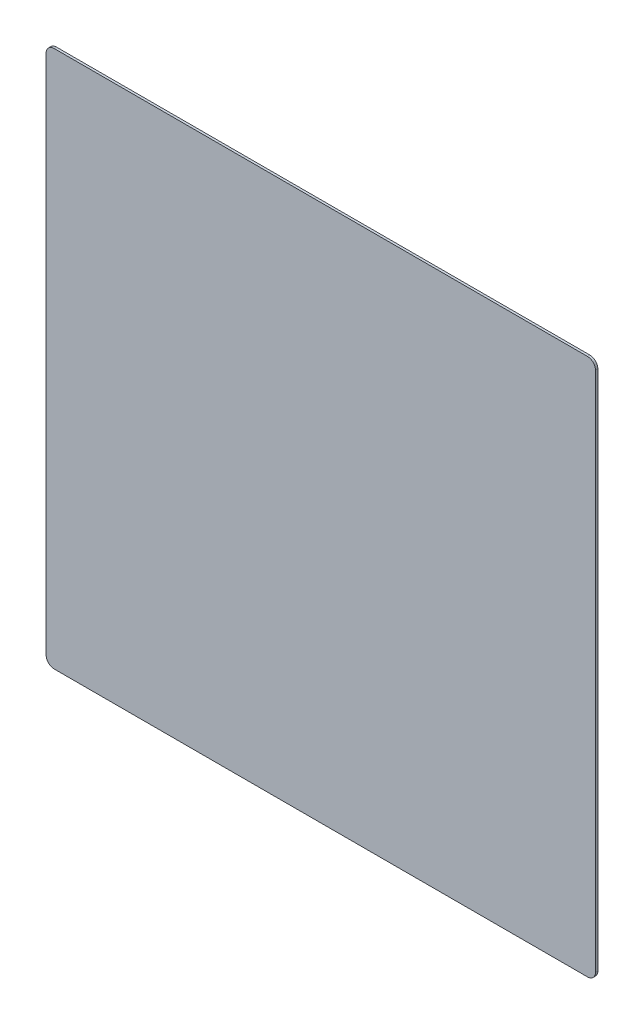
ISO-10303-21;
HEADER;
FILE_DESCRIPTION(('STEP AP214'),'2;1');
FILE_NAME('part.step','',(''),(''),'','','');
FILE_SCHEMA(('AUTOMOTIVE_DESIGN { 1 0 10303 214 1 1 1 1 }'));
ENDSEC;
DATA;
#1=APPLICATION_CONTEXT('core data for automotive mechanical design processes');
#2=APPLICATION_PROTOCOL_DEFINITION('international standard','automotive_design',2000,#1);
#3=PRODUCT_CONTEXT('',#1,'mechanical');
#4=PRODUCT('Part','Part','',(#3));
#5=PRODUCT_RELATED_PRODUCT_CATEGORY('part','',(#4));
#6=PRODUCT_DEFINITION_FORMATION('','',#4);
#7=PRODUCT_DEFINITION_CONTEXT('part definition',#1,'design');
#8=PRODUCT_DEFINITION('design','',#6,#7);
#9=PRODUCT_DEFINITION_SHAPE('','',#8);
#10=(LENGTH_UNIT() NAMED_UNIT(*) SI_UNIT(.MILLI.,.METRE.));
#11=(NAMED_UNIT(*) PLANE_ANGLE_UNIT() SI_UNIT($,.RADIAN.));
#12=(NAMED_UNIT(*) SI_UNIT($,.STERADIAN.) SOLID_ANGLE_UNIT());
#13=UNCERTAINTY_MEASURE_WITH_UNIT(LENGTH_MEASURE(1.E-05),#10,'distance_accuracy_value','');
#14=(GEOMETRIC_REPRESENTATION_CONTEXT(3) GLOBAL_UNCERTAINTY_ASSIGNED_CONTEXT((#13)) GLOBAL_UNIT_ASSIGNED_CONTEXT((#10,
#11,#12)) REPRESENTATION_CONTEXT('',''));
#15=CARTESIAN_POINT('',(0.,0.,0.));
#16=DIRECTION('',(0.,0.,1.));
#17=DIRECTION('',(1.,0.,0.));
#18=AXIS2_PLACEMENT_3D('',#15,#16,#17);
#19=CARTESIAN_POINT('',(345.,-337.5,3.));
#20=DIRECTION('',(-1.,0.,0.));
#21=DIRECTION('',(0.,0.,1.));
#22=AXIS2_PLACEMENT_3D('',#19,#20,#21);
#23=PLANE('',#22);
#24=DIRECTION('',(0.,1.,0.));
#25=VECTOR('',#24,1.);
#26=CARTESIAN_POINT('',(345.,-337.5,3.));
#27=LINE('',#26,#25);
#28=CARTESIAN_POINT('',(345.,-327.5,3.));
#29=VERTEX_POINT('',#28);
#30=CARTESIAN_POINT('',(345.,327.5,3.));
#31=VERTEX_POINT('',#30);
#32=EDGE_CURVE('E128',#29,#31,#27,.T.);
#33=ORIENTED_EDGE('',*,*,#32,.F.);
#34=DIRECTION('',(0.,0.,-1.));
#35=VECTOR('',#34,1.);
#36=CARTESIAN_POINT('',(345.,-327.5,3.));
#37=LINE('',#36,#35);
#38=CARTESIAN_POINT('',(345.,-327.5,0.));
#39=VERTEX_POINT('',#38);
#40=EDGE_CURVE('E154',#29,#39,#37,.T.);
#41=ORIENTED_EDGE('',*,*,#40,.T.);
#42=DIRECTION('',(0.,1.,0.));
#43=VECTOR('',#42,1.);
#44=CARTESIAN_POINT('',(345.,-337.5,0.));
#45=LINE('',#44,#43);
#46=CARTESIAN_POINT('',(345.,327.5,0.));
#47=VERTEX_POINT('',#46);
#48=EDGE_CURVE('E162',#39,#47,#45,.T.);
#49=ORIENTED_EDGE('',*,*,#48,.T.);
#50=DIRECTION('',(0.,0.,-1.));
#51=VECTOR('',#50,1.);
#52=CARTESIAN_POINT('',(345.,327.5,3.));
#53=LINE('',#52,#51);
#54=EDGE_CURVE('E152',#47,#31,#53,.F.);
#55=ORIENTED_EDGE('',*,*,#54,.T.);
#56=EDGE_LOOP('',(#33,#41,#49,#55));
#57=FACE_BOUND('',#56,.T.);
#58=ADVANCED_FACE('F37',(#57),#23,.F.);
#59=CARTESIAN_POINT('',(-345.,337.5,3.));
#60=DIRECTION('',(0.,-1.,0.));
#61=DIRECTION('',(0.,0.,-1.));
#62=AXIS2_PLACEMENT_3D('',#59,#60,#61);
#63=PLANE('',#62);
#64=DIRECTION('',(-1.,0.,0.));
#65=VECTOR('',#64,1.);
#66=CARTESIAN_POINT('',(-345.,337.5,0.));
#67=LINE('',#66,#65);
#68=CARTESIAN_POINT('',(335.,337.5,0.));
#69=VERTEX_POINT('',#68);
#70=CARTESIAN_POINT('',(-335.,337.5,0.));
#71=VERTEX_POINT('',#70);
#72=EDGE_CURVE('E133',#69,#71,#67,.T.);
#73=ORIENTED_EDGE('',*,*,#72,.T.);
#74=DIRECTION('',(0.,0.,-1.));
#75=VECTOR('',#74,1.);
#76=CARTESIAN_POINT('',(-335.,337.5,3.));
#77=LINE('',#76,#75);
#78=CARTESIAN_POINT('',(-335.,337.5,3.));
#79=VERTEX_POINT('',#78);
#80=EDGE_CURVE('E11',#71,#79,#77,.F.);
#81=ORIENTED_EDGE('',*,*,#80,.T.);
#82=DIRECTION('',(-1.,0.,0.));
#83=VECTOR('',#82,1.);
#84=CARTESIAN_POINT('',(-345.,337.5,3.));
#85=LINE('',#84,#83);
#86=CARTESIAN_POINT('',(335.,337.5,3.));
#87=VERTEX_POINT('',#86);
#88=EDGE_CURVE('E131',#87,#79,#85,.T.);
#89=ORIENTED_EDGE('',*,*,#88,.F.);
#90=DIRECTION('',(0.,0.,-1.));
#91=VECTOR('',#90,1.);
#92=CARTESIAN_POINT('',(335.,337.5,3.));
#93=LINE('',#92,#91);
#94=EDGE_CURVE('E45',#87,#69,#93,.T.);
#95=ORIENTED_EDGE('',*,*,#94,.T.);
#96=EDGE_LOOP('',(#73,#81,#89,#95));
#97=FACE_BOUND('',#96,.T.);
#98=ADVANCED_FACE('F159',(#97),#63,.F.);
#99=CARTESIAN_POINT('',(-345.,-337.5,3.));
#100=DIRECTION('',(1.,0.,0.));
#101=DIRECTION('',(0.,0.,-1.));
#102=AXIS2_PLACEMENT_3D('',#99,#100,#101);
#103=PLANE('',#102);
#104=DIRECTION('',(0.,-1.,0.));
#105=VECTOR('',#104,1.);
#106=CARTESIAN_POINT('',(-345.,-337.5,0.));
#107=LINE('',#106,#105);
#108=CARTESIAN_POINT('',(-345.,327.5,0.));
#109=VERTEX_POINT('',#108);
#110=CARTESIAN_POINT('',(-345.,-327.5,0.));
#111=VERTEX_POINT('',#110);
#112=EDGE_CURVE('E129',#109,#111,#107,.T.);
#113=ORIENTED_EDGE('',*,*,#112,.T.);
#114=DIRECTION('',(0.,0.,-1.));
#115=VECTOR('',#114,1.);
#116=CARTESIAN_POINT('',(-345.,-327.5,3.));
#117=LINE('',#116,#115);
#118=CARTESIAN_POINT('',(-345.,-327.5,3.));
#119=VERTEX_POINT('',#118);
#120=EDGE_CURVE('E107',#111,#119,#117,.F.);
#121=ORIENTED_EDGE('',*,*,#120,.T.);
#122=DIRECTION('',(0.,-1.,0.));
#123=VECTOR('',#122,1.);
#124=CARTESIAN_POINT('',(-345.,-337.5,3.));
#125=LINE('',#124,#123);
#126=CARTESIAN_POINT('',(-345.,327.5,3.));
#127=VERTEX_POINT('',#126);
#128=EDGE_CURVE('E166',#127,#119,#125,.T.);
#129=ORIENTED_EDGE('',*,*,#128,.F.);
#130=DIRECTION('',(0.,0.,-1.));
#131=VECTOR('',#130,1.);
#132=CARTESIAN_POINT('',(-345.,327.5,3.));
#133=LINE('',#132,#131);
#134=EDGE_CURVE('E112',#127,#109,#133,.T.);
#135=ORIENTED_EDGE('',*,*,#134,.T.);
#136=EDGE_LOOP('',(#113,#121,#129,#135));
#137=FACE_BOUND('',#136,.T.);
#138=ADVANCED_FACE('F176',(#137),#103,.F.);
#139=CARTESIAN_POINT('',(-345.,-337.5,3.));
#140=DIRECTION('',(0.,1.,0.));
#141=DIRECTION('',(0.,0.,1.));
#142=AXIS2_PLACEMENT_3D('',#139,#140,#141);
#143=PLANE('',#142);
#144=DIRECTION('',(1.,0.,0.));
#145=VECTOR('',#144,1.);
#146=CARTESIAN_POINT('',(-345.,-337.5,3.));
#147=LINE('',#146,#145);
#148=CARTESIAN_POINT('',(-335.,-337.5,3.));
#149=VERTEX_POINT('',#148);
#150=CARTESIAN_POINT('',(335.,-337.5,3.));
#151=VERTEX_POINT('',#150);
#152=EDGE_CURVE('E122',#149,#151,#147,.T.);
#153=ORIENTED_EDGE('',*,*,#152,.F.);
#154=DIRECTION('',(0.,0.,-1.));
#155=VECTOR('',#154,1.);
#156=CARTESIAN_POINT('',(-335.,-337.5,3.));
#157=LINE('',#156,#155);
#158=CARTESIAN_POINT('',(-335.,-337.5,0.));
#159=VERTEX_POINT('',#158);
#160=EDGE_CURVE('E106',#149,#159,#157,.T.);
#161=ORIENTED_EDGE('',*,*,#160,.T.);
#162=DIRECTION('',(1.,0.,0.));
#163=VECTOR('',#162,1.);
#164=CARTESIAN_POINT('',(-345.,-337.5,0.));
#165=LINE('',#164,#163);
#166=CARTESIAN_POINT('',(335.,-337.5,0.));
#167=VERTEX_POINT('',#166);
#168=EDGE_CURVE('E119',#159,#167,#165,.T.);
#169=ORIENTED_EDGE('',*,*,#168,.T.);
#170=DIRECTION('',(0.,0.,-1.));
#171=VECTOR('',#170,1.);
#172=CARTESIAN_POINT('',(335.,-337.5,3.));
#173=LINE('',#172,#171);
#174=EDGE_CURVE('E124',#167,#151,#173,.F.);
#175=ORIENTED_EDGE('',*,*,#174,.T.);
#176=EDGE_LOOP('',(#153,#161,#169,#175));
#177=FACE_BOUND('',#176,.T.);
#178=ADVANCED_FACE('F118',(#177),#143,.F.);
#179=CARTESIAN_POINT('',(0.,0.,3.));
#180=DIRECTION('',(0.,0.,-1.));
#181=DIRECTION('',(-1.,0.,0.));
#182=AXIS2_PLACEMENT_3D('',#179,#180,#181);
#183=PLANE('',#182);
#184=ORIENTED_EDGE('',*,*,#128,.T.);
#185=CARTESIAN_POINT('',(-335.,-327.5,3.));
#186=DIRECTION('',(0.,0.,-1.));
#187=DIRECTION('',(-1.,0.,0.));
#188=AXIS2_PLACEMENT_3D('',#185,#186,#187);
#189=CIRCLE('',#188,10.);
#190=EDGE_CURVE('E150',#119,#149,#189,.F.);
#191=ORIENTED_EDGE('',*,*,#190,.T.);
#192=ORIENTED_EDGE('',*,*,#152,.T.);
#193=CARTESIAN_POINT('',(335.,-327.5,3.));
#194=DIRECTION('',(0.,0.,-1.));
#195=DIRECTION('',(-1.,0.,0.));
#196=AXIS2_PLACEMENT_3D('',#193,#194,#195);
#197=CIRCLE('',#196,10.);
#198=EDGE_CURVE('E148',#151,#29,#197,.F.);
#199=ORIENTED_EDGE('',*,*,#198,.T.);
#200=ORIENTED_EDGE('',*,*,#32,.T.);
#201=CARTESIAN_POINT('',(335.,327.5,3.));
#202=DIRECTION('',(0.,0.,-1.));
#203=DIRECTION('',(-1.,0.,0.));
#204=AXIS2_PLACEMENT_3D('',#201,#202,#203);
#205=CIRCLE('',#204,10.);
#206=EDGE_CURVE('E57',#31,#87,#205,.F.);
#207=ORIENTED_EDGE('',*,*,#206,.T.);
#208=ORIENTED_EDGE('',*,*,#88,.T.);
#209=CARTESIAN_POINT('',(-335.,327.5,3.));
#210=DIRECTION('',(0.,0.,-1.));
#211=DIRECTION('',(-1.,0.,0.));
#212=AXIS2_PLACEMENT_3D('',#209,#210,#211);
#213=CIRCLE('',#212,10.);
#214=EDGE_CURVE('E146',#79,#127,#213,.F.);
#215=ORIENTED_EDGE('',*,*,#214,.T.);
#216=EDGE_LOOP('',(#184,#191,#192,#199,#200,#207,#208,#215));
#217=FACE_BOUND('',#216,.T.);
#218=ADVANCED_FACE('F170',(#217),#183,.F.);
#219=CARTESIAN_POINT('',(0.,0.,0.));
#220=DIRECTION('',(0.,0.,-1.));
#221=DIRECTION('',(-1.,0.,0.));
#222=AXIS2_PLACEMENT_3D('',#219,#220,#221);
#223=PLANE('',#222);
#224=ORIENTED_EDGE('',*,*,#168,.F.);
#225=CARTESIAN_POINT('',(-335.,-327.5,0.));
#226=DIRECTION('',(0.,0.,-1.));
#227=DIRECTION('',(-1.,0.,0.));
#228=AXIS2_PLACEMENT_3D('',#225,#226,#227);
#229=CIRCLE('',#228,10.);
#230=EDGE_CURVE('E102',#159,#111,#229,.T.);
#231=ORIENTED_EDGE('',*,*,#230,.T.);
#232=ORIENTED_EDGE('',*,*,#112,.F.);
#233=CARTESIAN_POINT('',(-335.,327.5,0.));
#234=DIRECTION('',(0.,0.,-1.));
#235=DIRECTION('',(-1.,0.,0.));
#236=AXIS2_PLACEMENT_3D('',#233,#234,#235);
#237=CIRCLE('',#236,10.);
#238=EDGE_CURVE('E139',#109,#71,#237,.T.);
#239=ORIENTED_EDGE('',*,*,#238,.T.);
#240=ORIENTED_EDGE('',*,*,#72,.F.);
#241=CARTESIAN_POINT('',(335.,327.5,0.));
#242=DIRECTION('',(0.,0.,-1.));
#243=DIRECTION('',(-1.,0.,0.));
#244=AXIS2_PLACEMENT_3D('',#241,#242,#243);
#245=CIRCLE('',#244,10.);
#246=EDGE_CURVE('E123',#69,#47,#245,.T.);
#247=ORIENTED_EDGE('',*,*,#246,.T.);
#248=ORIENTED_EDGE('',*,*,#48,.F.);
#249=CARTESIAN_POINT('',(335.,-327.5,0.));
#250=DIRECTION('',(0.,0.,-1.));
#251=DIRECTION('',(-1.,0.,0.));
#252=AXIS2_PLACEMENT_3D('',#249,#250,#251);
#253=CIRCLE('',#252,10.);
#254=EDGE_CURVE('E113',#39,#167,#253,.T.);
#255=ORIENTED_EDGE('',*,*,#254,.T.);
#256=EDGE_LOOP('',(#224,#231,#232,#239,#240,#247,#248,#255));
#257=FACE_BOUND('',#256,.T.);
#258=ADVANCED_FACE('F126',(#257),#223,.T.);
#259=CARTESIAN_POINT('',(-335.,-327.5,3.));
#260=DIRECTION('',(0.,0.,-1.));
#261=DIRECTION('',(-1.,0.,0.));
#262=AXIS2_PLACEMENT_3D('',#259,#260,#261);
#263=CYLINDRICAL_SURFACE('',#262,10.);
#264=ORIENTED_EDGE('',*,*,#190,.F.);
#265=ORIENTED_EDGE('',*,*,#120,.F.);
#266=ORIENTED_EDGE('',*,*,#230,.F.);
#267=ORIENTED_EDGE('',*,*,#160,.F.);
#268=EDGE_LOOP('',(#264,#265,#266,#267));
#269=FACE_BOUND('',#268,.T.);
#270=ADVANCED_FACE('F105',(#269),#263,.T.);
#271=CARTESIAN_POINT('',(335.,-327.5,3.));
#272=DIRECTION('',(0.,0.,-1.));
#273=DIRECTION('',(-1.,0.,0.));
#274=AXIS2_PLACEMENT_3D('',#271,#272,#273);
#275=CYLINDRICAL_SURFACE('',#274,10.);
#276=ORIENTED_EDGE('',*,*,#198,.F.);
#277=ORIENTED_EDGE('',*,*,#174,.F.);
#278=ORIENTED_EDGE('',*,*,#254,.F.);
#279=ORIENTED_EDGE('',*,*,#40,.F.);
#280=EDGE_LOOP('',(#276,#277,#278,#279));
#281=FACE_BOUND('',#280,.T.);
#282=ADVANCED_FACE('F181',(#281),#275,.T.);
#283=CARTESIAN_POINT('',(-335.,327.5,3.));
#284=DIRECTION('',(0.,0.,-1.));
#285=DIRECTION('',(-1.,0.,0.));
#286=AXIS2_PLACEMENT_3D('',#283,#284,#285);
#287=CYLINDRICAL_SURFACE('',#286,10.);
#288=ORIENTED_EDGE('',*,*,#214,.F.);
#289=ORIENTED_EDGE('',*,*,#80,.F.);
#290=ORIENTED_EDGE('',*,*,#238,.F.);
#291=ORIENTED_EDGE('',*,*,#134,.F.);
#292=EDGE_LOOP('',(#288,#289,#290,#291));
#293=FACE_BOUND('',#292,.T.);
#294=ADVANCED_FACE('F174',(#293),#287,.T.);
#295=CARTESIAN_POINT('',(335.,327.5,3.));
#296=DIRECTION('',(0.,0.,-1.));
#297=DIRECTION('',(-1.,0.,0.));
#298=AXIS2_PLACEMENT_3D('',#295,#296,#297);
#299=CYLINDRICAL_SURFACE('',#298,10.);
#300=ORIENTED_EDGE('',*,*,#206,.F.);
#301=ORIENTED_EDGE('',*,*,#54,.F.);
#302=ORIENTED_EDGE('',*,*,#246,.F.);
#303=ORIENTED_EDGE('',*,*,#94,.F.);
#304=EDGE_LOOP('',(#300,#301,#302,#303));
#305=FACE_BOUND('',#304,.T.);
#306=ADVANCED_FACE('F39',(#305),#299,.T.);
#307=CLOSED_SHELL('',(#58,#98,#138,#178,#218,#258,#270,#282,#294,#306));
#308=MANIFOLD_SOLID_BREP('B2',#307);
#309=ADVANCED_BREP_SHAPE_REPRESENTATION('',(#18,#308),#14);
#310=SHAPE_DEFINITION_REPRESENTATION(#9,#309);
ENDSEC;
END-ISO-10303-21;
